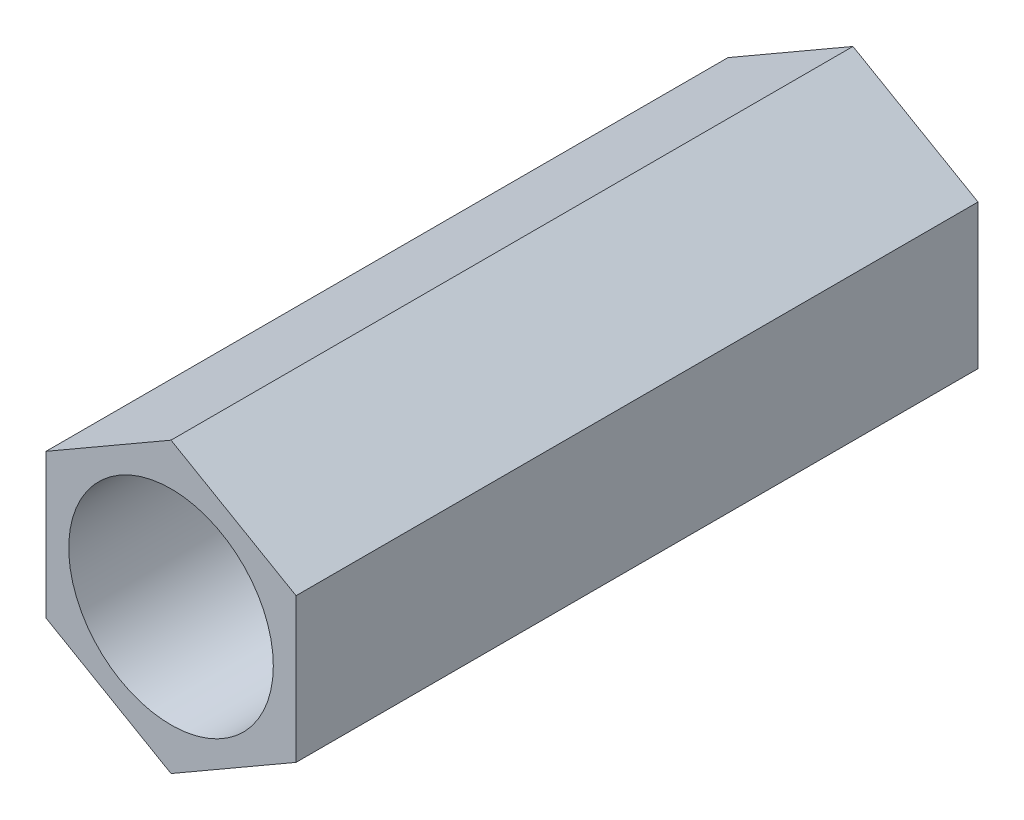
ISO-10303-21;
HEADER;
FILE_DESCRIPTION(('STEP AP214'),'2;1');
FILE_NAME('part.step','',(''),(''),'','','');
FILE_SCHEMA(('AUTOMOTIVE_DESIGN { 1 0 10303 214 1 1 1 1 }'));
ENDSEC;
DATA;
#1=APPLICATION_CONTEXT('core data for automotive mechanical design processes');
#2=APPLICATION_PROTOCOL_DEFINITION('international standard','automotive_design',2000,#1);
#3=PRODUCT_CONTEXT('',#1,'mechanical');
#4=PRODUCT('Part','Part','',(#3));
#5=PRODUCT_RELATED_PRODUCT_CATEGORY('part','',(#4));
#6=PRODUCT_DEFINITION_FORMATION('','',#4);
#7=PRODUCT_DEFINITION_CONTEXT('part definition',#1,'design');
#8=PRODUCT_DEFINITION('design','',#6,#7);
#9=PRODUCT_DEFINITION_SHAPE('','',#8);
#10=(LENGTH_UNIT() NAMED_UNIT(*) SI_UNIT(.MILLI.,.METRE.));
#11=(NAMED_UNIT(*) PLANE_ANGLE_UNIT() SI_UNIT($,.RADIAN.));
#12=(NAMED_UNIT(*) SI_UNIT($,.STERADIAN.) SOLID_ANGLE_UNIT());
#13=UNCERTAINTY_MEASURE_WITH_UNIT(LENGTH_MEASURE(1.E-05),#10,'distance_accuracy_value','');
#14=(GEOMETRIC_REPRESENTATION_CONTEXT(3) GLOBAL_UNCERTAINTY_ASSIGNED_CONTEXT((#13)) GLOBAL_UNIT_ASSIGNED_CONTEXT((#10,
#11,#12)) REPRESENTATION_CONTEXT('',''));
#15=CARTESIAN_POINT('',(0.,0.,0.));
#16=DIRECTION('',(0.,0.,1.));
#17=DIRECTION('',(1.,0.,0.));
#18=AXIS2_PLACEMENT_3D('',#15,#16,#17);
#19=CARTESIAN_POINT('',(0.,0.,15.));
#20=DIRECTION('',(0.,0.,1.));
#21=DIRECTION('',(1.,0.,0.));
#22=AXIS2_PLACEMENT_3D('',#19,#20,#21);
#23=PLANE('',#22);
#24=DIRECTION('',(-0.866025403784439,0.5,0.));
#25=VECTOR('',#24,1.);
#26=CARTESIAN_POINT('',(2.75000000000001,1.58771324027147,15.));
#27=LINE('',#26,#25);
#28=CARTESIAN_POINT('',(2.75000000000001,1.58771324027147,15.));
#29=VERTEX_POINT('',#28);
#30=CARTESIAN_POINT('',(0.,3.17542648054293,15.));
#31=VERTEX_POINT('',#30);
#32=EDGE_CURVE('E128',#29,#31,#27,.T.);
#33=ORIENTED_EDGE('',*,*,#32,.T.);
#34=DIRECTION('',(-0.866025403784441,-0.499999999999996,0.));
#35=VECTOR('',#34,1.);
#36=CARTESIAN_POINT('',(0.,3.17542648054293,15.));
#37=LINE('',#36,#35);
#38=CARTESIAN_POINT('',(-2.75000000000002,1.58771324027146,15.));
#39=VERTEX_POINT('',#38);
#40=EDGE_CURVE('E86',#31,#39,#37,.T.);
#41=ORIENTED_EDGE('',*,*,#40,.T.);
#42=DIRECTION('',(0.,-1.,0.));
#43=VECTOR('',#42,1.);
#44=CARTESIAN_POINT('',(-2.75000000000002,1.58771324027146,15.));
#45=LINE('',#44,#43);
#46=CARTESIAN_POINT('',(-2.75000000000001,-1.58771324027149,15.));
#47=VERTEX_POINT('',#46);
#48=EDGE_CURVE('E99',#39,#47,#45,.T.);
#49=ORIENTED_EDGE('',*,*,#48,.T.);
#50=DIRECTION('',(0.86602540378444,-0.499999999999998,0.));
#51=VECTOR('',#50,1.);
#52=CARTESIAN_POINT('',(-2.75000000000001,-1.58771324027149,15.));
#53=LINE('',#52,#51);
#54=CARTESIAN_POINT('',(0.,-3.17542648054296,15.));
#55=VERTEX_POINT('',#54);
#56=EDGE_CURVE('E93',#47,#55,#53,.T.);
#57=ORIENTED_EDGE('',*,*,#56,.T.);
#58=DIRECTION('',(0.866025403784439,0.499999999999998,0.));
#59=VECTOR('',#58,1.);
#60=CARTESIAN_POINT('',(0.,-3.17542648054296,15.));
#61=LINE('',#60,#59);
#62=CARTESIAN_POINT('',(2.75,-1.58771324027149,15.));
#63=VERTEX_POINT('',#62);
#64=EDGE_CURVE('E97',#55,#63,#61,.T.);
#65=ORIENTED_EDGE('',*,*,#64,.T.);
#66=DIRECTION('',(0.,1.,0.));
#67=VECTOR('',#66,1.);
#68=CARTESIAN_POINT('',(2.75,-1.58771324027149,15.));
#69=LINE('',#68,#67);
#70=EDGE_CURVE('E49',#63,#29,#69,.T.);
#71=ORIENTED_EDGE('',*,*,#70,.T.);
#72=EDGE_LOOP('',(#33,#41,#49,#57,#65,#71));
#73=FACE_BOUND('',#72,.T.);
#74=CARTESIAN_POINT('',(0.,0.,15.));
#75=DIRECTION('',(0.,0.,1.));
#76=DIRECTION('',(1.,0.,0.));
#77=AXIS2_PLACEMENT_3D('',#74,#75,#76);
#78=CIRCLE('',#77,2.25);
#79=CARTESIAN_POINT('',(2.25,0.,15.));
#80=VERTEX_POINT('',#79);
#81=EDGE_CURVE('E121',#80,#80,#78,.T.);
#82=ORIENTED_EDGE('',*,*,#81,.F.);
#83=EDGE_LOOP('',(#82));
#84=FACE_BOUND('',#83,.T.);
#85=ADVANCED_FACE('F32',(#73,#84),#23,.T.);
#86=CARTESIAN_POINT('',(0.,0.,0.));
#87=DIRECTION('',(0.,0.,1.));
#88=DIRECTION('',(1.,0.,0.));
#89=AXIS2_PLACEMENT_3D('',#86,#87,#88);
#90=PLANE('',#89);
#91=DIRECTION('',(-0.866025403784439,0.5,0.));
#92=VECTOR('',#91,1.);
#93=CARTESIAN_POINT('',(2.75000000000001,1.58771324027147,0.));
#94=LINE('',#93,#92);
#95=CARTESIAN_POINT('',(2.75000000000001,1.58771324027147,0.));
#96=VERTEX_POINT('',#95);
#97=CARTESIAN_POINT('',(0.,3.17542648054293,0.));
#98=VERTEX_POINT('',#97);
#99=EDGE_CURVE('E117',#96,#98,#94,.T.);
#100=ORIENTED_EDGE('',*,*,#99,.F.);
#101=DIRECTION('',(0.,1.,0.));
#102=VECTOR('',#101,1.);
#103=CARTESIAN_POINT('',(2.75,-1.58771324027149,0.));
#104=LINE('',#103,#102);
#105=CARTESIAN_POINT('',(2.75,-1.58771324027149,0.));
#106=VERTEX_POINT('',#105);
#107=EDGE_CURVE('E78',#106,#96,#104,.T.);
#108=ORIENTED_EDGE('',*,*,#107,.F.);
#109=DIRECTION('',(0.866025403784439,0.499999999999998,0.));
#110=VECTOR('',#109,1.);
#111=CARTESIAN_POINT('',(0.,-3.17542648054296,0.));
#112=LINE('',#111,#110);
#113=CARTESIAN_POINT('',(0.,-3.17542648054296,0.));
#114=VERTEX_POINT('',#113);
#115=EDGE_CURVE('E72',#114,#106,#112,.T.);
#116=ORIENTED_EDGE('',*,*,#115,.F.);
#117=DIRECTION('',(0.86602540378444,-0.499999999999998,0.));
#118=VECTOR('',#117,1.);
#119=CARTESIAN_POINT('',(-2.75000000000001,-1.58771324027149,0.));
#120=LINE('',#119,#118);
#121=CARTESIAN_POINT('',(-2.75000000000001,-1.58771324027149,0.));
#122=VERTEX_POINT('',#121);
#123=EDGE_CURVE('E107',#122,#114,#120,.T.);
#124=ORIENTED_EDGE('',*,*,#123,.F.);
#125=DIRECTION('',(0.,-1.,0.));
#126=VECTOR('',#125,1.);
#127=CARTESIAN_POINT('',(-2.75000000000002,1.58771324027146,0.));
#128=LINE('',#127,#126);
#129=CARTESIAN_POINT('',(-2.75000000000002,1.58771324027146,0.));
#130=VERTEX_POINT('',#129);
#131=EDGE_CURVE('E123',#130,#122,#128,.T.);
#132=ORIENTED_EDGE('',*,*,#131,.F.);
#133=DIRECTION('',(-0.866025403784441,-0.499999999999996,0.));
#134=VECTOR('',#133,1.);
#135=CARTESIAN_POINT('',(0.,3.17542648054293,0.));
#136=LINE('',#135,#134);
#137=EDGE_CURVE('E120',#98,#130,#136,.T.);
#138=ORIENTED_EDGE('',*,*,#137,.F.);
#139=EDGE_LOOP('',(#100,#108,#116,#124,#132,#138));
#140=FACE_BOUND('',#139,.T.);
#141=CARTESIAN_POINT('',(0.,0.,0.));
#142=DIRECTION('',(0.,0.,1.));
#143=DIRECTION('',(1.,0.,0.));
#144=AXIS2_PLACEMENT_3D('',#141,#142,#143);
#145=CIRCLE('',#144,2.25);
#146=CARTESIAN_POINT('',(2.25,0.,0.));
#147=VERTEX_POINT('',#146);
#148=EDGE_CURVE('E221',#147,#147,#145,.T.);
#149=ORIENTED_EDGE('',*,*,#148,.T.);
#150=EDGE_LOOP('',(#149));
#151=FACE_BOUND('',#150,.T.);
#152=ADVANCED_FACE('F137',(#140,#151),#90,.F.);
#153=CARTESIAN_POINT('',(2.75000000000001,1.58771324027147,15.));
#154=DIRECTION('',(-0.5,-0.866025403784439,0.));
#155=DIRECTION('',(0.866025403784439,-0.5,0.));
#156=AXIS2_PLACEMENT_3D('',#153,#154,#155);
#157=PLANE('',#156);
#158=ORIENTED_EDGE('',*,*,#99,.T.);
#159=DIRECTION('',(0.,0.,-1.));
#160=VECTOR('',#159,1.);
#161=CARTESIAN_POINT('',(0.,3.17542648054293,15.));
#162=LINE('',#161,#160);
#163=EDGE_CURVE('E11',#31,#98,#162,.T.);
#164=ORIENTED_EDGE('',*,*,#163,.F.);
#165=ORIENTED_EDGE('',*,*,#32,.F.);
#166=DIRECTION('',(0.,0.,-1.));
#167=VECTOR('',#166,1.);
#168=CARTESIAN_POINT('',(2.75000000000001,1.58771324027147,15.));
#169=LINE('',#168,#167);
#170=EDGE_CURVE('E113',#29,#96,#169,.T.);
#171=ORIENTED_EDGE('',*,*,#170,.T.);
#172=EDGE_LOOP('',(#158,#164,#165,#171));
#173=FACE_BOUND('',#172,.T.);
#174=ADVANCED_FACE('F34',(#173),#157,.F.);
#175=CARTESIAN_POINT('',(0.,3.17542648054293,15.));
#176=DIRECTION('',(0.499999999999996,-0.866025403784441,0.));
#177=DIRECTION('',(0.866025403784441,0.499999999999996,0.));
#178=AXIS2_PLACEMENT_3D('',#175,#176,#177);
#179=PLANE('',#178);
#180=ORIENTED_EDGE('',*,*,#137,.T.);
#181=DIRECTION('',(0.,0.,-1.));
#182=VECTOR('',#181,1.);
#183=CARTESIAN_POINT('',(-2.75000000000002,1.58771324027146,15.));
#184=LINE('',#183,#182);
#185=EDGE_CURVE('E41',#39,#130,#184,.T.);
#186=ORIENTED_EDGE('',*,*,#185,.F.);
#187=ORIENTED_EDGE('',*,*,#40,.F.);
#188=ORIENTED_EDGE('',*,*,#163,.T.);
#189=EDGE_LOOP('',(#180,#186,#187,#188));
#190=FACE_BOUND('',#189,.T.);
#191=ADVANCED_FACE('F162',(#190),#179,.F.);
#192=CARTESIAN_POINT('',(-2.75000000000002,1.58771324027146,15.));
#193=DIRECTION('',(1.,0.,0.));
#194=DIRECTION('',(0.,1.,0.));
#195=AXIS2_PLACEMENT_3D('',#192,#193,#194);
#196=PLANE('',#195);
#197=ORIENTED_EDGE('',*,*,#131,.T.);
#198=DIRECTION('',(0.,0.,-1.));
#199=VECTOR('',#198,1.);
#200=CARTESIAN_POINT('',(-2.75000000000001,-1.58771324027149,15.));
#201=LINE('',#200,#199);
#202=EDGE_CURVE('E108',#47,#122,#201,.T.);
#203=ORIENTED_EDGE('',*,*,#202,.F.);
#204=ORIENTED_EDGE('',*,*,#48,.F.);
#205=ORIENTED_EDGE('',*,*,#185,.T.);
#206=EDGE_LOOP('',(#197,#203,#204,#205));
#207=FACE_BOUND('',#206,.T.);
#208=ADVANCED_FACE('F134',(#207),#196,.F.);
#209=CARTESIAN_POINT('',(-2.75000000000001,-1.58771324027149,15.));
#210=DIRECTION('',(0.499999999999998,0.86602540378444,0.));
#211=DIRECTION('',(-0.86602540378444,0.499999999999998,0.));
#212=AXIS2_PLACEMENT_3D('',#209,#210,#211);
#213=PLANE('',#212);
#214=ORIENTED_EDGE('',*,*,#123,.T.);
#215=DIRECTION('',(0.,0.,-1.));
#216=VECTOR('',#215,1.);
#217=CARTESIAN_POINT('',(0.,-3.17542648054296,15.));
#218=LINE('',#217,#216);
#219=EDGE_CURVE('E104',#55,#114,#218,.T.);
#220=ORIENTED_EDGE('',*,*,#219,.F.);
#221=ORIENTED_EDGE('',*,*,#56,.F.);
#222=ORIENTED_EDGE('',*,*,#202,.T.);
#223=EDGE_LOOP('',(#214,#220,#221,#222));
#224=FACE_BOUND('',#223,.T.);
#225=ADVANCED_FACE('F105',(#224),#213,.F.);
#226=CARTESIAN_POINT('',(0.,-3.17542648054296,15.));
#227=DIRECTION('',(-0.499999999999998,0.866025403784439,0.));
#228=DIRECTION('',(-0.86602540378444,-0.499999999999999,0.));
#229=AXIS2_PLACEMENT_3D('',#226,#227,#228);
#230=PLANE('',#229);
#231=ORIENTED_EDGE('',*,*,#115,.T.);
#232=DIRECTION('',(0.,0.,-1.));
#233=VECTOR('',#232,1.);
#234=CARTESIAN_POINT('',(2.75,-1.58771324027149,15.));
#235=LINE('',#234,#233);
#236=EDGE_CURVE('E109',#63,#106,#235,.T.);
#237=ORIENTED_EDGE('',*,*,#236,.F.);
#238=ORIENTED_EDGE('',*,*,#64,.F.);
#239=ORIENTED_EDGE('',*,*,#219,.T.);
#240=EDGE_LOOP('',(#231,#237,#238,#239));
#241=FACE_BOUND('',#240,.T.);
#242=ADVANCED_FACE('F111',(#241),#230,.F.);
#243=CARTESIAN_POINT('',(2.75,-1.58771324027149,15.));
#244=DIRECTION('',(-1.,0.,0.));
#245=DIRECTION('',(0.,-1.,0.));
#246=AXIS2_PLACEMENT_3D('',#243,#244,#245);
#247=PLANE('',#246);
#248=ORIENTED_EDGE('',*,*,#107,.T.);
#249=ORIENTED_EDGE('',*,*,#170,.F.);
#250=ORIENTED_EDGE('',*,*,#70,.F.);
#251=ORIENTED_EDGE('',*,*,#236,.T.);
#252=EDGE_LOOP('',(#248,#249,#250,#251));
#253=FACE_BOUND('',#252,.T.);
#254=ADVANCED_FACE('F142',(#253),#247,.F.);
#255=CARTESIAN_POINT('',(0.,0.,15.));
#256=DIRECTION('',(0.,0.,-1.));
#257=DIRECTION('',(-1.,0.,0.));
#258=AXIS2_PLACEMENT_3D('',#255,#256,#257);
#259=CYLINDRICAL_SURFACE('',#258,2.25);
#260=ORIENTED_EDGE('',*,*,#81,.T.);
#261=EDGE_LOOP('',(#260));
#262=FACE_BOUND('',#261,.T.);
#263=ORIENTED_EDGE('',*,*,#148,.F.);
#264=EDGE_LOOP('',(#263));
#265=FACE_BOUND('',#264,.T.);
#266=ADVANCED_FACE('F144',(#262,#265),#259,.F.);
#267=CLOSED_SHELL('',(#85,#152,#174,#191,#208,#225,#242,#254,#266));
#268=MANIFOLD_SOLID_BREP('B2',#267);
#269=ADVANCED_BREP_SHAPE_REPRESENTATION('',(#18,#268),#14);
#270=SHAPE_DEFINITION_REPRESENTATION(#9,#269);
ENDSEC;
END-ISO-10303-21;
